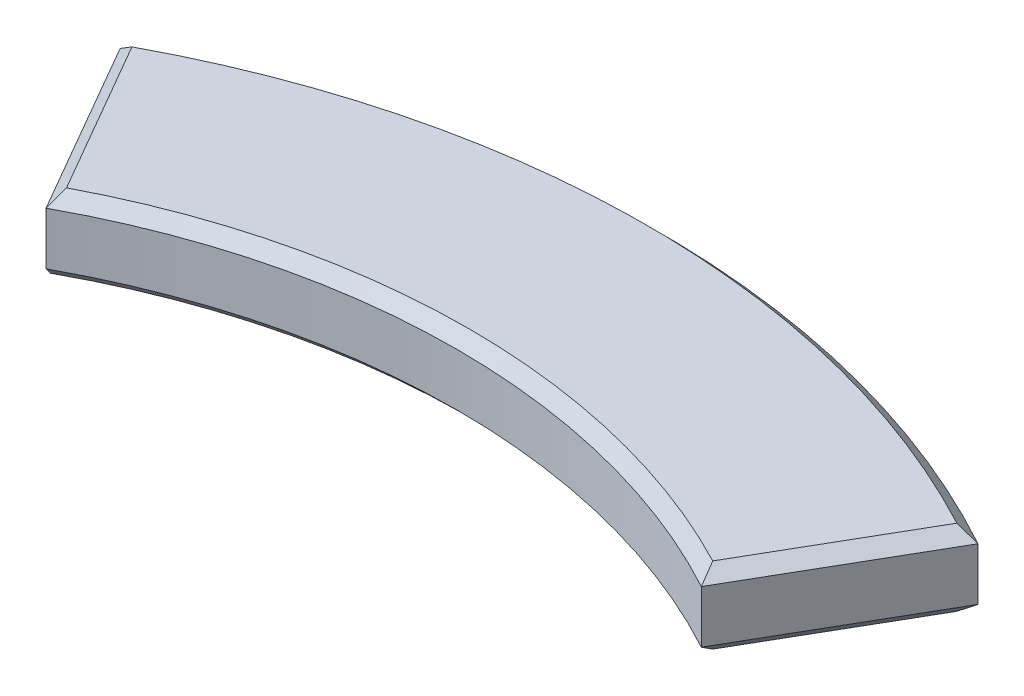
ISO-10303-21;
HEADER;
FILE_DESCRIPTION(('STEP AP214'),'2;1');
FILE_NAME('part.step','',(''),(''),'','','');
FILE_SCHEMA(('AUTOMOTIVE_DESIGN { 1 0 10303 214 1 1 1 1 }'));
ENDSEC;
DATA;
#1=APPLICATION_CONTEXT('core data for automotive mechanical design processes');
#2=APPLICATION_PROTOCOL_DEFINITION('international standard','automotive_design',2000,#1);
#3=PRODUCT_CONTEXT('',#1,'mechanical');
#4=PRODUCT('Part','Part','',(#3));
#5=PRODUCT_RELATED_PRODUCT_CATEGORY('part','',(#4));
#6=PRODUCT_DEFINITION_FORMATION('','',#4);
#7=PRODUCT_DEFINITION_CONTEXT('part definition',#1,'design');
#8=PRODUCT_DEFINITION('design','',#6,#7);
#9=PRODUCT_DEFINITION_SHAPE('','',#8);
#10=(LENGTH_UNIT() NAMED_UNIT(*) SI_UNIT(.MILLI.,.METRE.));
#11=(NAMED_UNIT(*) PLANE_ANGLE_UNIT() SI_UNIT($,.RADIAN.));
#12=(NAMED_UNIT(*) SI_UNIT($,.STERADIAN.) SOLID_ANGLE_UNIT());
#13=UNCERTAINTY_MEASURE_WITH_UNIT(LENGTH_MEASURE(1.E-05),#10,'distance_accuracy_value','');
#14=(GEOMETRIC_REPRESENTATION_CONTEXT(3) GLOBAL_UNCERTAINTY_ASSIGNED_CONTEXT((#13)) GLOBAL_UNIT_ASSIGNED_CONTEXT((#10,
#11,#12)) REPRESENTATION_CONTEXT('',''));
#15=CARTESIAN_POINT('',(0.,0.,0.));
#16=DIRECTION('',(0.,0.,1.));
#17=DIRECTION('',(1.,0.,0.));
#18=AXIS2_PLACEMENT_3D('',#15,#16,#17);
#19=CARTESIAN_POINT('',(0.,3.2,0.));
#20=DIRECTION('',(0.,-1.,0.));
#21=DIRECTION('',(0.,0.,-1.));
#22=AXIS2_PLACEMENT_3D('',#19,#20,#21);
#23=CYLINDRICAL_SURFACE('',#22,37.25);
#24=DIRECTION('',(0.,-1.,0.));
#25=VECTOR('',#24,1.);
#26=CARTESIAN_POINT('',(17.9717053966978,3.2,-32.6279068457403));
#27=LINE('',#26,#25);
#28=CARTESIAN_POINT('',(17.9717053966978,2.7,-32.6279068457403));
#29=VERTEX_POINT('',#28);
#30=CARTESIAN_POINT('',(17.9717053966978,0.500000000000011,-32.6279068457403));
#31=VERTEX_POINT('',#30);
#32=EDGE_CURVE('E306',#29,#31,#27,.T.);
#33=ORIENTED_EDGE('',*,*,#32,.T.);
#34=CARTESIAN_POINT('',(0.,0.500000000000011,0.));
#35=DIRECTION('',(0.,-1.,0.));
#36=DIRECTION('',(0.,0.,-1.));
#37=AXIS2_PLACEMENT_3D('',#34,#35,#36);
#38=CIRCLE('',#37,37.25);
#39=CARTESIAN_POINT('',(-17.9717053966979,0.500000000000011,-32.6279068457402));
#40=VERTEX_POINT('',#39);
#41=EDGE_CURVE('E139',#31,#40,#38,.F.);
#42=ORIENTED_EDGE('',*,*,#41,.T.);
#43=DIRECTION('',(0.,-1.,0.));
#44=VECTOR('',#43,1.);
#45=CARTESIAN_POINT('',(-17.9717053966979,3.2,-32.6279068457402));
#46=LINE('',#45,#44);
#47=CARTESIAN_POINT('',(-17.9717053966979,2.7,-32.6279068457402));
#48=VERTEX_POINT('',#47);
#49=EDGE_CURVE('E128',#48,#40,#46,.T.);
#50=ORIENTED_EDGE('',*,*,#49,.F.);
#51=CARTESIAN_POINT('',(0.,2.7,0.));
#52=DIRECTION('',(0.,-1.,0.));
#53=DIRECTION('',(0.,0.,-1.));
#54=AXIS2_PLACEMENT_3D('',#51,#52,#53);
#55=CIRCLE('',#54,37.25);
#56=EDGE_CURVE('E144',#48,#29,#55,.T.);
#57=ORIENTED_EDGE('',*,*,#56,.T.);
#58=EDGE_LOOP('',(#33,#42,#50,#57));
#59=FACE_BOUND('',#58,.T.);
#60=ADVANCED_FACE('F47',(#59),#23,.T.);
#61=CARTESIAN_POINT('',(-17.9717053966979,3.2,-32.6279068457402));
#62=DIRECTION('',(0.866025403784436,0.,-0.500000000000004));
#63=DIRECTION('',(-0.500000000000004,0.,-0.866025403784436));
#64=AXIS2_PLACEMENT_3D('',#61,#62,#63);
#65=PLANE('',#64);
#66=ORIENTED_EDGE('',*,*,#49,.T.);
#67=CARTESIAN_POINT('',(-17.9717053966979,0.500000000000011,-32.6279068457402));
#68=CARTESIAN_POINT('',(-17.9300302247856,0.416666550913295,-32.555723330574));
#69=CARTESIAN_POINT('',(-17.888355023941,0.33333315970327,-32.4835397652955));
#70=CARTESIAN_POINT('',(-17.8050045643869,0.166666493036599,-32.3391725345136));
#71=CARTESIAN_POINT('',(-17.7633293056775,0.0833332175799531,-32.2669888690103));
#72=CARTESIAN_POINT('',(-17.7216540180356,0.,-32.1948051533945));
#73=B_SPLINE_CURVE_WITH_KNOTS('',3,(#67,#68,#69,#70,#71,#72),.UNSPECIFIED.,.F.,.F.,(4,2,4),(0.,
0.353589722660248,0.7071794453205),.UNSPECIFIED.);
#74=CARTESIAN_POINT('',(-17.7216540180356,0.,-32.1948051533945));
#75=VERTEX_POINT('',#74);
#76=EDGE_CURVE('E171',#40,#75,#73,.T.);
#77=ORIENTED_EDGE('',*,*,#76,.T.);
#78=DIRECTION('',(0.500000000000004,0.,0.866025403784436));
#79=VECTOR('',#78,1.);
#80=CARTESIAN_POINT('',(-17.9717053966979,0.,-32.6279068457402));
#81=LINE('',#80,#79);
#82=CARTESIAN_POINT('',(-13.9793400516933,0.,-25.7129272258151));
#83=VERTEX_POINT('',#82);
#84=EDGE_CURVE('E220',#75,#83,#81,.T.);
#85=ORIENTED_EDGE('',*,*,#84,.T.);
#86=CARTESIAN_POINT('',(-13.9793400516933,0.,-25.7129272258151));
#87=CARTESIAN_POINT('',(-13.937659579346,0.0833335734081343,-25.6407345300261));
#88=CARTESIAN_POINT('',(-13.8959790470001,0.166667026778868,-25.5685417303164));
#89=CARTESIAN_POINT('',(-13.8126178623109,0.333333693445539,-25.4241559230556));
#90=CARTESIAN_POINT('',(-13.7709372099676,0.416666906741475,-25.3519629155044));
#91=CARTESIAN_POINT('',(-13.7292564976257,0.500000000000011,-25.2797698040326));
#92=B_SPLINE_CURVE_WITH_KNOTS('',3,(#86,#87,#88,#89,#90,#91),.UNSPECIFIED.,.F.,.F.,(4,2,4),(0.,
0.353612477177128,0.707224954354268),.UNSPECIFIED.);
#93=CARTESIAN_POINT('',(-13.7292564976257,0.500000000000011,-25.2797698040326));
#94=VERTEX_POINT('',#93);
#95=EDGE_CURVE('E137',#83,#94,#92,.T.);
#96=ORIENTED_EDGE('',*,*,#95,.T.);
#97=DIRECTION('',(0.,-1.,0.));
#98=VECTOR('',#97,1.);
#99=CARTESIAN_POINT('',(-13.7292564976257,3.2,-25.2797698040326));
#100=LINE('',#99,#98);
#101=CARTESIAN_POINT('',(-13.7292564976257,2.7,-25.2797698040326));
#102=VERTEX_POINT('',#101);
#103=EDGE_CURVE('E131',#102,#94,#100,.T.);
#104=ORIENTED_EDGE('',*,*,#103,.F.);
#105=DIRECTION('',(-0.500000000000004,0.,-0.866025403784436));
#106=VECTOR('',#105,1.);
#107=CARTESIAN_POINT('',(-17.9717053966979,2.7,-32.6279068457402));
#108=LINE('',#107,#106);
#109=EDGE_CURVE('E129',#102,#48,#108,.T.);
#110=ORIENTED_EDGE('',*,*,#109,.T.);
#111=EDGE_LOOP('',(#66,#77,#85,#96,#104,#110));
#112=FACE_BOUND('',#111,.T.);
#113=ADVANCED_FACE('F130',(#112),#65,.F.);
#114=CARTESIAN_POINT('',(0.,3.2,0.));
#115=DIRECTION('',(0.,-1.,0.));
#116=DIRECTION('',(0.,0.,-1.));
#117=AXIS2_PLACEMENT_3D('',#114,#115,#116);
#118=CYLINDRICAL_SURFACE('',#117,28.7673294784635);
#119=ORIENTED_EDGE('',*,*,#103,.T.);
#120=CARTESIAN_POINT('',(0.,0.500000000000011,0.));
#121=DIRECTION('',(0.,-1.,0.));
#122=DIRECTION('',(0.,0.,-1.));
#123=AXIS2_PLACEMENT_3D('',#120,#121,#122);
#124=CIRCLE('',#123,28.7673294784635);
#125=CARTESIAN_POINT('',(13.7292564976256,0.500000000000011,-25.2797698040326));
#126=VERTEX_POINT('',#125);
#127=EDGE_CURVE('E283',#94,#126,#124,.T.);
#128=ORIENTED_EDGE('',*,*,#127,.T.);
#129=DIRECTION('',(0.,-1.,0.));
#130=VECTOR('',#129,1.);
#131=CARTESIAN_POINT('',(13.7292564976256,3.2,-25.2797698040326));
#132=LINE('',#131,#130);
#133=CARTESIAN_POINT('',(13.7292564976256,2.7,-25.2797698040326));
#134=VERTEX_POINT('',#133);
#135=EDGE_CURVE('E307',#134,#126,#132,.T.);
#136=ORIENTED_EDGE('',*,*,#135,.F.);
#137=CARTESIAN_POINT('',(0.,2.7,0.));
#138=DIRECTION('',(0.,-1.,0.));
#139=DIRECTION('',(0.,0.,-1.));
#140=AXIS2_PLACEMENT_3D('',#137,#138,#139);
#141=CIRCLE('',#140,28.7673294784635);
#142=EDGE_CURVE('E254',#134,#102,#141,.F.);
#143=ORIENTED_EDGE('',*,*,#142,.T.);
#144=EDGE_LOOP('',(#119,#128,#136,#143));
#145=FACE_BOUND('',#144,.T.);
#146=ADVANCED_FACE('F187',(#145),#118,.F.);
#147=CARTESIAN_POINT('',(17.9717053966978,3.2,-32.6279068457403));
#148=DIRECTION('',(-0.866025403784441,0.,-0.499999999999996));
#149=DIRECTION('',(-0.499999999999996,0.,0.866025403784441));
#150=AXIS2_PLACEMENT_3D('',#147,#148,#149);
#151=PLANE('',#150);
#152=ORIENTED_EDGE('',*,*,#135,.T.);
#153=DIRECTION('',(0.499999999999996,0.,-0.866025403784441));
#154=VECTOR('',#153,1.);
#155=CARTESIAN_POINT('',(17.9717053966978,0.500000000000011,-32.6279068457403));
#156=LINE('',#155,#154);
#157=EDGE_CURVE('E262',#126,#31,#156,.T.);
#158=ORIENTED_EDGE('',*,*,#157,.T.);
#159=ORIENTED_EDGE('',*,*,#32,.F.);
#160=DIRECTION('',(-0.499999999999996,0.,0.866025403784441));
#161=VECTOR('',#160,1.);
#162=CARTESIAN_POINT('',(17.9717053966978,2.7,-32.6279068457403));
#163=LINE('',#162,#161);
#164=EDGE_CURVE('E274',#29,#134,#163,.T.);
#165=ORIENTED_EDGE('',*,*,#164,.T.);
#166=EDGE_LOOP('',(#152,#158,#159,#165));
#167=FACE_BOUND('',#166,.T.);
#168=ADVANCED_FACE('F327',(#167),#151,.F.);
#169=CARTESIAN_POINT('',(0.,3.2,0.));
#170=DIRECTION('',(0.,-1.,0.));
#171=DIRECTION('',(0.,0.,-1.));
#172=AXIS2_PLACEMENT_3D('',#169,#170,#171);
#173=PLANE('',#172);
#174=CARTESIAN_POINT('',(0.,3.2,0.));
#175=DIRECTION('',(0.,-1.,0.));
#176=DIRECTION('',(0.,0.,-1.));
#177=AXIS2_PLACEMENT_3D('',#174,#175,#176);
#178=CIRCLE('',#177,29.2673294784635);
#179=CARTESIAN_POINT('',(-13.5377800989967,3.2,-25.9481229531569));
#180=VERTEX_POINT('',#179);
#181=CARTESIAN_POINT('',(13.5377800989967,3.2,-25.9481229531569));
#182=VERTEX_POINT('',#181);
#183=EDGE_CURVE('E78',#180,#182,#178,.T.);
#184=ORIENTED_EDGE('',*,*,#183,.T.);
#185=DIRECTION('',(0.499999999999996,0.,-0.866025403784441));
#186=VECTOR('',#185,1.);
#187=CARTESIAN_POINT('',(-1.08253175473036,3.2,-0.624999999999887));
#188=LINE('',#187,#186);
#189=CARTESIAN_POINT('',(17.2818359174764,3.2,-32.4330178571378));
#190=VERTEX_POINT('',#189);
#191=EDGE_CURVE('E12',#182,#190,#188,.T.);
#192=ORIENTED_EDGE('',*,*,#191,.T.);
#193=CARTESIAN_POINT('',(0.,3.2,0.));
#194=DIRECTION('',(0.,-1.,0.));
#195=DIRECTION('',(0.,0.,-1.));
#196=AXIS2_PLACEMENT_3D('',#193,#194,#195);
#197=CIRCLE('',#196,36.75);
#198=CARTESIAN_POINT('',(-17.2818359174766,3.2,-32.4330178571378));
#199=VERTEX_POINT('',#198);
#200=EDGE_CURVE('E62',#190,#199,#197,.F.);
#201=ORIENTED_EDGE('',*,*,#200,.T.);
#202=DIRECTION('',(0.500000000000004,0.,0.866025403784436));
#203=VECTOR('',#202,1.);
#204=CARTESIAN_POINT('',(1.08253175473055,3.2,-0.62500000000001));
#205=LINE('',#204,#203);
#206=EDGE_CURVE('E155',#199,#180,#205,.T.);
#207=ORIENTED_EDGE('',*,*,#206,.T.);
#208=EDGE_LOOP('',(#184,#192,#201,#207));
#209=FACE_BOUND('',#208,.T.);
#210=ADVANCED_FACE('F293',(#209),#173,.F.);
#211=CARTESIAN_POINT('',(0.,0.,0.));
#212=DIRECTION('',(0.,-1.,0.));
#213=DIRECTION('',(0.,0.,-1.));
#214=AXIS2_PLACEMENT_3D('',#211,#212,#213);
#215=PLANE('',#214);
#216=CARTESIAN_POINT('',(0.,0.,-33.));
#217=DIRECTION('',(0.,-1.,0.));
#218=DIRECTION('',(0.,0.,-1.));
#219=AXIS2_PLACEMENT_3D('',#216,#217,#218);
#220=CIRCLE('',#219,1.625);
#221=CARTESIAN_POINT('',(0.,0.,-34.625));
#222=VERTEX_POINT('',#221);
#223=EDGE_CURVE('E298',#222,#222,#220,.T.);
#224=ORIENTED_EDGE('',*,*,#223,.F.);
#225=EDGE_LOOP('',(#224));
#226=FACE_BOUND('',#225,.T.);
#227=ORIENTED_EDGE('',*,*,#84,.F.);
#228=CARTESIAN_POINT('',(0.,0.,0.));
#229=DIRECTION('',(0.,-1.,0.));
#230=DIRECTION('',(0.,0.,-1.));
#231=AXIS2_PLACEMENT_3D('',#228,#229,#230);
#232=CIRCLE('',#231,36.75);
#233=CARTESIAN_POINT('',(17.2818359174764,0.,-32.4330178571378));
#234=VERTEX_POINT('',#233);
#235=EDGE_CURVE('E261',#75,#234,#232,.T.);
#236=ORIENTED_EDGE('',*,*,#235,.T.);
#237=DIRECTION('',(-0.499999999999996,0.,0.866025403784441));
#238=VECTOR('',#237,1.);
#239=CARTESIAN_POINT('',(13.2962437957334,0.,-25.5297698040326));
#240=LINE('',#239,#238);
#241=CARTESIAN_POINT('',(13.5377800989967,0.,-25.9481229531569));
#242=VERTEX_POINT('',#241);
#243=EDGE_CURVE('E264',#234,#242,#240,.T.);
#244=ORIENTED_EDGE('',*,*,#243,.T.);
#245=CARTESIAN_POINT('',(0.,0.,0.));
#246=DIRECTION('',(0.,-1.,0.));
#247=DIRECTION('',(0.,0.,-1.));
#248=AXIS2_PLACEMENT_3D('',#245,#246,#247);
#249=CIRCLE('',#248,29.2673294784635);
#250=EDGE_CURVE('E270',#242,#83,#249,.F.);
#251=ORIENTED_EDGE('',*,*,#250,.T.);
#252=EDGE_LOOP('',(#227,#236,#244,#251));
#253=FACE_BOUND('',#252,.T.);
#254=ADVANCED_FACE('F316',(#226,#253),#215,.T.);
#255=CARTESIAN_POINT('',(0.,0.500000000000011,0.));
#256=DIRECTION('',(0.,-1.,0.));
#257=DIRECTION('',(0.,0.,-1.));
#258=AXIS2_PLACEMENT_3D('',#255,#256,#257);
#259=CONICAL_SURFACE('',#258,28.7673294784635,0.785398163397448);
#260=ORIENTED_EDGE('',*,*,#95,.F.);
#261=ORIENTED_EDGE('',*,*,#250,.F.);
#262=CARTESIAN_POINT('',(13.5377800989967,0.,-25.9481229531569));
#263=CARTESIAN_POINT('',(13.5701127048345,0.0835541928518643,-25.8370162835055));
#264=CARTESIAN_POINT('',(13.6022353737954,0.166997954597289,-25.7257668547296));
#265=CARTESIAN_POINT('',(13.6660608400323,0.333664621278277,-25.5029824717066));
#266=CARTESIAN_POINT('',(13.6977636372811,0.416887526199521,-25.3914475174411));
#267=CARTESIAN_POINT('',(13.7292564976256,0.500000000000005,-25.2797698040326));
#268=B_SPLINE_CURVE_WITH_KNOTS('',3,(#262,#263,#264,#265,#266,#267),.UNSPECIFIED.,.F.,.F.,(4,2,
4),(0.,0.428182745735112,0.856365519231983),.UNSPECIFIED.);
#269=EDGE_CURVE('E209',#126,#242,#268,.F.);
#270=ORIENTED_EDGE('',*,*,#269,.F.);
#271=ORIENTED_EDGE('',*,*,#127,.F.);
#272=EDGE_LOOP('',(#260,#261,#270,#271));
#273=FACE_BOUND('',#272,.T.);
#274=ADVANCED_FACE('F177',(#273),#259,.F.);
#275=CARTESIAN_POINT('',(17.9717053966978,0.500000000000011,-32.6279068457403));
#276=DIRECTION('',(0.612372435695801,-0.707106781186542,0.353553390593273));
#277=DIRECTION('',(-0.499999999999996,0.,0.866025403784441));
#278=AXIS2_PLACEMENT_3D('',#275,#276,#277);
#279=PLANE('',#278);
#280=ORIENTED_EDGE('',*,*,#269,.T.);
#281=ORIENTED_EDGE('',*,*,#243,.F.);
#282=CARTESIAN_POINT('',(17.2818359174764,0.,-32.4330178571378));
#283=CARTESIAN_POINT('',(17.3968356146589,0.0831334038750539,-32.4659363677628));
#284=CARTESIAN_POINT('',(17.5118245875774,0.166366773248676,-32.4986363724206));
#285=CARTESIAN_POINT('',(17.7417810806504,0.333033439922712,-32.5635993686053));
#286=CARTESIAN_POINT('',(17.8567486008056,0.41646673721576,-32.5958623601483));
#287=CARTESIAN_POINT('',(17.9717053966978,0.50000000000001,-32.6279068457403));
#288=B_SPLINE_CURVE_WITH_KNOTS('',3,(#282,#283,#284,#285,#286,#287),.UNSPECIFIED.,.F.,.F.,(4,2,
4),(0.,0.437007931018329,0.874015845935485),.UNSPECIFIED.);
#289=EDGE_CURVE('E204',#31,#234,#288,.F.);
#290=ORIENTED_EDGE('',*,*,#289,.F.);
#291=ORIENTED_EDGE('',*,*,#157,.F.);
#292=EDGE_LOOP('',(#280,#281,#290,#291));
#293=FACE_BOUND('',#292,.T.);
#294=ADVANCED_FACE('F191',(#293),#279,.T.);
#295=CARTESIAN_POINT('',(0.,0.500000000000011,0.));
#296=DIRECTION('',(0.,1.,0.));
#297=DIRECTION('',(0.,0.,1.));
#298=AXIS2_PLACEMENT_3D('',#295,#296,#297);
#299=CONICAL_SURFACE('',#298,37.25,0.785398163397452);
#300=ORIENTED_EDGE('',*,*,#289,.T.);
#301=ORIENTED_EDGE('',*,*,#235,.F.);
#302=ORIENTED_EDGE('',*,*,#76,.F.);
#303=ORIENTED_EDGE('',*,*,#41,.F.);
#304=EDGE_LOOP('',(#300,#301,#302,#303));
#305=FACE_BOUND('',#304,.T.);
#306=ADVANCED_FACE('F198',(#305),#299,.T.);
#307=CARTESIAN_POINT('',(1.08253175473055,3.2,-0.625000000000009));
#308=DIRECTION('',(0.612372435695791,-0.70710678118655,-0.353553390593275));
#309=DIRECTION('',(0.500000000000004,0.,0.866025403784436));
#310=AXIS2_PLACEMENT_3D('',#307,#308,#309);
#311=PLANE('',#310);
#312=CARTESIAN_POINT('',(-17.2818359174766,3.2,-32.4330178571378));
#313=CARTESIAN_POINT('',(-17.396835614659,3.11686659612495,-32.4659363677627));
#314=CARTESIAN_POINT('',(-17.5118245875775,3.03363322675133,-32.4986363724205));
#315=CARTESIAN_POINT('',(-17.7417810806505,2.86696656007729,-32.5635993686052));
#316=CARTESIAN_POINT('',(-17.8567486008058,2.78353326278425,-32.5958623601482));
#317=CARTESIAN_POINT('',(-17.9717053966979,2.7,-32.6279068457402));
#318=B_SPLINE_CURVE_WITH_KNOTS('',3,(#312,#313,#314,#315,#316,#317),.UNSPECIFIED.,.F.,.F.,(4,2,
4),(0.,0.437007931018325,0.874015845935477),.UNSPECIFIED.);
#319=EDGE_CURVE('E151',#48,#199,#318,.F.);
#320=ORIENTED_EDGE('',*,*,#319,.F.);
#321=ORIENTED_EDGE('',*,*,#109,.F.);
#322=CARTESIAN_POINT('',(-13.7292564976257,2.7,-25.2797698040326));
#323=CARTESIAN_POINT('',(-13.6977636372811,2.78311247380048,-25.3914475174411));
#324=CARTESIAN_POINT('',(-13.6660608400323,2.86633537872173,-25.5029824717066));
#325=CARTESIAN_POINT('',(-13.6022353737954,3.03300204540271,-25.7257668547295));
#326=CARTESIAN_POINT('',(-13.5701127048346,3.11644580714814,-25.8370162835054));
#327=CARTESIAN_POINT('',(-13.5377800989967,3.2,-25.9481229531569));
#328=B_SPLINE_CURVE_WITH_KNOTS('',3,(#322,#323,#324,#325,#326,#327),.UNSPECIFIED.,.F.,.F.,(4,2,
4),(0.,0.428182773496876,0.856365519231986),.UNSPECIFIED.);
#329=EDGE_CURVE('E54',#180,#102,#328,.F.);
#330=ORIENTED_EDGE('',*,*,#329,.F.);
#331=ORIENTED_EDGE('',*,*,#206,.F.);
#332=EDGE_LOOP('',(#320,#321,#330,#331));
#333=FACE_BOUND('',#332,.T.);
#334=ADVANCED_FACE('F55',(#333),#311,.F.);
#335=CARTESIAN_POINT('',(0.,3.2,0.));
#336=DIRECTION('',(0.,1.,0.));
#337=DIRECTION('',(0.,0.,1.));
#338=AXIS2_PLACEMENT_3D('',#335,#336,#337);
#339=CONICAL_SURFACE('',#338,29.2673294784635,0.785398163397452);
#340=ORIENTED_EDGE('',*,*,#329,.T.);
#341=ORIENTED_EDGE('',*,*,#142,.F.);
#342=CARTESIAN_POINT('',(13.7292564976256,2.7,-25.2797698040326));
#343=CARTESIAN_POINT('',(13.6977636372811,2.78311247380048,-25.3914475174411));
#344=CARTESIAN_POINT('',(13.6660608400323,2.86633537872173,-25.5029824717066));
#345=CARTESIAN_POINT('',(13.6022353737954,3.03300204540272,-25.7257668547296));
#346=CARTESIAN_POINT('',(13.5701127048345,3.11644580714814,-25.8370162835055));
#347=CARTESIAN_POINT('',(13.5377800989967,3.2,-25.9481229531569));
#348=B_SPLINE_CURVE_WITH_KNOTS('',3,(#342,#343,#344,#345,#346,#347),.UNSPECIFIED.,.F.,.F.,(4,2,
4),(0.,0.428182773496867,0.856365519231974),.UNSPECIFIED.);
#349=EDGE_CURVE('E154',#182,#134,#348,.F.);
#350=ORIENTED_EDGE('',*,*,#349,.F.);
#351=ORIENTED_EDGE('',*,*,#183,.F.);
#352=EDGE_LOOP('',(#340,#341,#350,#351));
#353=FACE_BOUND('',#352,.T.);
#354=ADVANCED_FACE('F239',(#353),#339,.F.);
#355=CARTESIAN_POINT('',(0.,3.2,0.));
#356=DIRECTION('',(0.,-1.,0.));
#357=DIRECTION('',(0.,0.,-1.));
#358=AXIS2_PLACEMENT_3D('',#355,#356,#357);
#359=CONICAL_SURFACE('',#358,36.75,0.785398163397448);
#360=ORIENTED_EDGE('',*,*,#319,.T.);
#361=ORIENTED_EDGE('',*,*,#200,.F.);
#362=CARTESIAN_POINT('',(17.2818359174764,3.2,-32.4330178571378));
#363=CARTESIAN_POINT('',(17.3968356146589,3.11686659612495,-32.4659363677628));
#364=CARTESIAN_POINT('',(17.5118245875774,3.03363322675133,-32.4986363724206));
#365=CARTESIAN_POINT('',(17.7417810806504,2.86696656007729,-32.5635993686053));
#366=CARTESIAN_POINT('',(17.8567486008056,2.78353326278425,-32.5958623601483));
#367=CARTESIAN_POINT('',(17.9717053966978,2.7,-32.6279068457403));
#368=B_SPLINE_CURVE_WITH_KNOTS('',3,(#362,#363,#364,#365,#366,#367),.UNSPECIFIED.,.F.,.F.,(4,2,
4),(0.,0.437007931018322,0.874015845935472),.UNSPECIFIED.);
#369=EDGE_CURVE('E74',#29,#190,#368,.F.);
#370=ORIENTED_EDGE('',*,*,#369,.F.);
#371=ORIENTED_EDGE('',*,*,#56,.F.);
#372=EDGE_LOOP('',(#360,#361,#370,#371));
#373=FACE_BOUND('',#372,.T.);
#374=ADVANCED_FACE('F156',(#373),#359,.T.);
#375=CARTESIAN_POINT('',(-1.08253175473037,3.2,-0.624999999999888));
#376=DIRECTION('',(-0.612372435695794,-0.70710678118655,-0.353553390593269));
#377=DIRECTION('',(0.499999999999996,0.,-0.866025403784441));
#378=AXIS2_PLACEMENT_3D('',#375,#376,#377);
#379=PLANE('',#378);
#380=ORIENTED_EDGE('',*,*,#349,.T.);
#381=ORIENTED_EDGE('',*,*,#164,.F.);
#382=ORIENTED_EDGE('',*,*,#369,.T.);
#383=ORIENTED_EDGE('',*,*,#191,.F.);
#384=EDGE_LOOP('',(#380,#381,#382,#383));
#385=FACE_BOUND('',#384,.T.);
#386=ADVANCED_FACE('F231',(#385),#379,.F.);
#387=CARTESIAN_POINT('',(0.,2.,-33.));
#388=DIRECTION('',(0.,-1.,0.));
#389=DIRECTION('',(0.,0.,-1.));
#390=AXIS2_PLACEMENT_3D('',#387,#388,#389);
#391=CYLINDRICAL_SURFACE('',#390,1.625);
#392=CARTESIAN_POINT('',(0.,2.,-33.));
#393=DIRECTION('',(0.,-1.,0.));
#394=DIRECTION('',(0.,0.,-1.));
#395=AXIS2_PLACEMENT_3D('',#392,#393,#394);
#396=CIRCLE('',#395,1.625);
#397=CARTESIAN_POINT('',(0.,2.,-34.625));
#398=VERTEX_POINT('',#397);
#399=EDGE_CURVE('E225',#398,#398,#396,.T.);
#400=ORIENTED_EDGE('',*,*,#399,.F.);
#401=EDGE_LOOP('',(#400));
#402=FACE_BOUND('',#401,.T.);
#403=ORIENTED_EDGE('',*,*,#223,.T.);
#404=EDGE_LOOP('',(#403));
#405=FACE_BOUND('',#404,.T.);
#406=ADVANCED_FACE('F237',(#402,#405),#391,.F.);
#407=CARTESIAN_POINT('',(0.,2.,-33.));
#408=DIRECTION('',(0.,-1.,0.));
#409=DIRECTION('',(0.,0.,-1.));
#410=AXIS2_PLACEMENT_3D('',#407,#408,#409);
#411=PLANE('',#410);
#412=ORIENTED_EDGE('',*,*,#399,.T.);
#413=EDGE_LOOP('',(#412));
#414=FACE_BOUND('',#413,.T.);
#415=ADVANCED_FACE('F406',(#414),#411,.T.);
#416=CLOSED_SHELL('',(#60,#113,#146,#168,#210,#254,#274,#294,#306,#334,#354,#374,#386,#406,#415));
#417=MANIFOLD_SOLID_BREP('B2',#416);
#418=ADVANCED_BREP_SHAPE_REPRESENTATION('',(#18,#417),#14);
#419=SHAPE_DEFINITION_REPRESENTATION(#9,#418);
ENDSEC;
END-ISO-10303-21;
